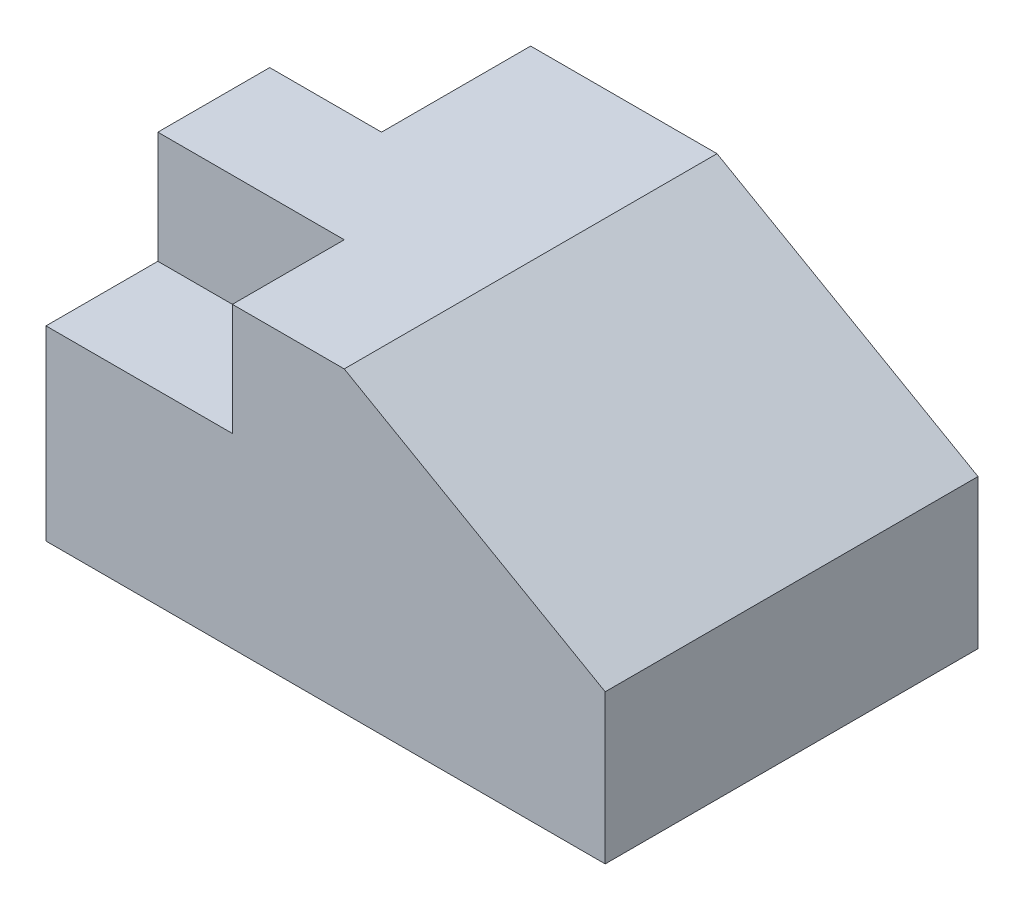
ISO-10303-21;
HEADER;
FILE_DESCRIPTION(('STEP AP214'),'2;1');
FILE_NAME('part.step','',(''),(''),'','','');
FILE_SCHEMA(('AUTOMOTIVE_DESIGN { 1 0 10303 214 1 1 1 1 }'));
ENDSEC;
DATA;
#1=APPLICATION_CONTEXT('core data for automotive mechanical design processes');
#2=APPLICATION_PROTOCOL_DEFINITION('international standard','automotive_design',2000,#1);
#3=PRODUCT_CONTEXT('',#1,'mechanical');
#4=PRODUCT('Part','Part','',(#3));
#5=PRODUCT_RELATED_PRODUCT_CATEGORY('part','',(#4));
#6=PRODUCT_DEFINITION_FORMATION('','',#4);
#7=PRODUCT_DEFINITION_CONTEXT('part definition',#1,'design');
#8=PRODUCT_DEFINITION('design','',#6,#7);
#9=PRODUCT_DEFINITION_SHAPE('','',#8);
#10=(LENGTH_UNIT() NAMED_UNIT(*) SI_UNIT(.MILLI.,.METRE.));
#11=(NAMED_UNIT(*) PLANE_ANGLE_UNIT() SI_UNIT($,.RADIAN.));
#12=(NAMED_UNIT(*) SI_UNIT($,.STERADIAN.) SOLID_ANGLE_UNIT());
#13=UNCERTAINTY_MEASURE_WITH_UNIT(LENGTH_MEASURE(1.E-05),#10,'distance_accuracy_value','');
#14=(GEOMETRIC_REPRESENTATION_CONTEXT(3) GLOBAL_UNCERTAINTY_ASSIGNED_CONTEXT((#13)) GLOBAL_UNIT_ASSIGNED_CONTEXT((#10,
#11,#12)) REPRESENTATION_CONTEXT('',''));
#15=CARTESIAN_POINT('',(0.,0.,0.));
#16=DIRECTION('',(0.,0.,1.));
#17=DIRECTION('',(1.,0.,0.));
#18=AXIS2_PLACEMENT_3D('',#15,#16,#17);
#19=CARTESIAN_POINT('',(0.,80.,-100.));
#20=DIRECTION('',(-1.,0.,0.));
#21=DIRECTION('',(0.,-1.,0.));
#22=AXIS2_PLACEMENT_3D('',#19,#20,#21);
#23=PLANE('',#22);
#24=DIRECTION('',(0.,1.,0.));
#25=VECTOR('',#24,1.);
#26=CARTESIAN_POINT('',(0.,50.,-30.));
#27=LINE('',#26,#25);
#28=CARTESIAN_POINT('',(0.,50.,-30.));
#29=VERTEX_POINT('',#28);
#30=CARTESIAN_POINT('',(0.,80.,-30.));
#31=VERTEX_POINT('',#30);
#32=EDGE_CURVE('E158',#29,#31,#27,.T.);
#33=ORIENTED_EDGE('',*,*,#32,.T.);
#34=DIRECTION('',(0.,0.,1.));
#35=VECTOR('',#34,1.);
#36=CARTESIAN_POINT('',(0.,80.,-100.));
#37=LINE('',#36,#35);
#38=CARTESIAN_POINT('',(0.,80.,-60.));
#39=VERTEX_POINT('',#38);
#40=EDGE_CURVE('E11',#39,#31,#37,.T.);
#41=ORIENTED_EDGE('',*,*,#40,.F.);
#42=DIRECTION('',(0.,1.,0.));
#43=VECTOR('',#42,1.);
#44=CARTESIAN_POINT('',(0.,50.,-60.));
#45=LINE('',#44,#43);
#46=CARTESIAN_POINT('',(0.,50.,-60.));
#47=VERTEX_POINT('',#46);
#48=EDGE_CURVE('E163',#47,#39,#45,.T.);
#49=ORIENTED_EDGE('',*,*,#48,.F.);
#50=DIRECTION('',(0.,0.,1.));
#51=VECTOR('',#50,1.);
#52=CARTESIAN_POINT('',(0.,50.,-100.));
#53=LINE('',#52,#51);
#54=CARTESIAN_POINT('',(0.,50.,-100.));
#55=VERTEX_POINT('',#54);
#56=EDGE_CURVE('E178',#55,#47,#53,.T.);
#57=ORIENTED_EDGE('',*,*,#56,.F.);
#58=DIRECTION('',(0.,-1.,0.));
#59=VECTOR('',#58,1.);
#60=CARTESIAN_POINT('',(0.,80.,-100.));
#61=LINE('',#60,#59);
#62=CARTESIAN_POINT('',(0.,0.,-100.));
#63=VERTEX_POINT('',#62);
#64=EDGE_CURVE('E193',#55,#63,#61,.T.);
#65=ORIENTED_EDGE('',*,*,#64,.T.);
#66=DIRECTION('',(0.,0.,1.));
#67=VECTOR('',#66,1.);
#68=CARTESIAN_POINT('',(0.,0.,-100.));
#69=LINE('',#68,#67);
#70=CARTESIAN_POINT('',(0.,0.,0.));
#71=VERTEX_POINT('',#70);
#72=EDGE_CURVE('E48',#63,#71,#69,.T.);
#73=ORIENTED_EDGE('',*,*,#72,.T.);
#74=DIRECTION('',(0.,-1.,0.));
#75=VECTOR('',#74,1.);
#76=CARTESIAN_POINT('',(0.,80.,0.));
#77=LINE('',#76,#75);
#78=CARTESIAN_POINT('',(0.,50.,0.));
#79=VERTEX_POINT('',#78);
#80=EDGE_CURVE('E212',#79,#71,#77,.T.);
#81=ORIENTED_EDGE('',*,*,#80,.F.);
#82=DIRECTION('',(0.,0.,1.));
#83=VECTOR('',#82,1.);
#84=CARTESIAN_POINT('',(0.,50.,0.));
#85=LINE('',#84,#83);
#86=EDGE_CURVE('E70',#29,#79,#85,.T.);
#87=ORIENTED_EDGE('',*,*,#86,.F.);
#88=EDGE_LOOP('',(#33,#41,#49,#57,#65,#73,#81,#87));
#89=FACE_BOUND('',#88,.T.);
#90=ADVANCED_FACE('F45',(#89),#23,.T.);
#91=CARTESIAN_POINT('',(80.,80.,-100.));
#92=DIRECTION('',(0.,1.,0.));
#93=DIRECTION('',(-1.,0.,0.));
#94=AXIS2_PLACEMENT_3D('',#91,#92,#93);
#95=PLANE('',#94);
#96=DIRECTION('',(-1.,0.,0.));
#97=VECTOR('',#96,1.);
#98=CARTESIAN_POINT('',(0.,80.,-30.));
#99=LINE('',#98,#97);
#100=CARTESIAN_POINT('',(50.,80.,-30.));
#101=VERTEX_POINT('',#100);
#102=EDGE_CURVE('E258',#101,#31,#99,.T.);
#103=ORIENTED_EDGE('',*,*,#102,.F.);
#104=DIRECTION('',(0.,0.,-1.));
#105=VECTOR('',#104,1.);
#106=CARTESIAN_POINT('',(50.,80.,0.));
#107=LINE('',#106,#105);
#108=CARTESIAN_POINT('',(50.,80.,0.));
#109=VERTEX_POINT('',#108);
#110=EDGE_CURVE('E182',#109,#101,#107,.T.);
#111=ORIENTED_EDGE('',*,*,#110,.F.);
#112=DIRECTION('',(-1.,0.,0.));
#113=VECTOR('',#112,1.);
#114=CARTESIAN_POINT('',(80.,80.,0.));
#115=LINE('',#114,#113);
#116=CARTESIAN_POINT('',(80.,80.,0.));
#117=VERTEX_POINT('',#116);
#118=EDGE_CURVE('E153',#117,#109,#115,.T.);
#119=ORIENTED_EDGE('',*,*,#118,.F.);
#120=DIRECTION('',(0.,0.,1.));
#121=VECTOR('',#120,1.);
#122=CARTESIAN_POINT('',(80.,80.,-100.));
#123=LINE('',#122,#121);
#124=CARTESIAN_POINT('',(80.,80.,-100.));
#125=VERTEX_POINT('',#124);
#126=EDGE_CURVE('E54',#125,#117,#123,.T.);
#127=ORIENTED_EDGE('',*,*,#126,.F.);
#128=DIRECTION('',(-1.,0.,0.));
#129=VECTOR('',#128,1.);
#130=CARTESIAN_POINT('',(80.,80.,-100.));
#131=LINE('',#130,#129);
#132=CARTESIAN_POINT('',(30.,80.,-100.));
#133=VERTEX_POINT('',#132);
#134=EDGE_CURVE('E208',#125,#133,#131,.T.);
#135=ORIENTED_EDGE('',*,*,#134,.T.);
#136=DIRECTION('',(0.,0.,-1.));
#137=VECTOR('',#136,1.);
#138=CARTESIAN_POINT('',(30.,80.,-100.));
#139=LINE('',#138,#137);
#140=CARTESIAN_POINT('',(30.,80.,-60.));
#141=VERTEX_POINT('',#140);
#142=EDGE_CURVE('E174',#141,#133,#139,.T.);
#143=ORIENTED_EDGE('',*,*,#142,.F.);
#144=DIRECTION('',(1.,0.,0.));
#145=VECTOR('',#144,1.);
#146=CARTESIAN_POINT('',(0.,80.,-60.));
#147=LINE('',#146,#145);
#148=EDGE_CURVE('E177',#39,#141,#147,.T.);
#149=ORIENTED_EDGE('',*,*,#148,.F.);
#150=ORIENTED_EDGE('',*,*,#40,.T.);
#151=EDGE_LOOP('',(#103,#111,#119,#127,#135,#143,#149,#150));
#152=FACE_BOUND('',#151,.T.);
#153=ADVANCED_FACE('F256',(#152),#95,.T.);
#154=CARTESIAN_POINT('',(150.,40.,-100.));
#155=DIRECTION('',(0.496138938356834,0.868243142124459,0.));
#156=DIRECTION('',(-0.868243142124459,0.496138938356834,0.));
#157=AXIS2_PLACEMENT_3D('',#154,#155,#156);
#158=PLANE('',#157);
#159=DIRECTION('',(-0.868243142124459,0.496138938356834,0.));
#160=VECTOR('',#159,1.);
#161=CARTESIAN_POINT('',(150.,40.,0.));
#162=LINE('',#161,#160);
#163=CARTESIAN_POINT('',(150.,40.,0.));
#164=VERTEX_POINT('',#163);
#165=EDGE_CURVE('E223',#164,#117,#162,.T.);
#166=ORIENTED_EDGE('',*,*,#165,.F.);
#167=DIRECTION('',(0.,0.,1.));
#168=VECTOR('',#167,1.);
#169=CARTESIAN_POINT('',(150.,40.,-100.));
#170=LINE('',#169,#168);
#171=CARTESIAN_POINT('',(150.,40.,-100.));
#172=VERTEX_POINT('',#171);
#173=EDGE_CURVE('E230',#172,#164,#170,.T.);
#174=ORIENTED_EDGE('',*,*,#173,.F.);
#175=DIRECTION('',(-0.868243142124459,0.496138938356834,0.));
#176=VECTOR('',#175,1.);
#177=CARTESIAN_POINT('',(150.,40.,-100.));
#178=LINE('',#177,#176);
#179=EDGE_CURVE('E204',#172,#125,#178,.T.);
#180=ORIENTED_EDGE('',*,*,#179,.T.);
#181=ORIENTED_EDGE('',*,*,#126,.T.);
#182=EDGE_LOOP('',(#166,#174,#180,#181));
#183=FACE_BOUND('',#182,.T.);
#184=ADVANCED_FACE('F252',(#183),#158,.T.);
#185=CARTESIAN_POINT('',(150.,0.,-100.));
#186=DIRECTION('',(1.,0.,0.));
#187=DIRECTION('',(0.,0.,-1.));
#188=AXIS2_PLACEMENT_3D('',#185,#186,#187);
#189=PLANE('',#188);
#190=DIRECTION('',(0.,1.,0.));
#191=VECTOR('',#190,1.);
#192=CARTESIAN_POINT('',(150.,0.,0.));
#193=LINE('',#192,#191);
#194=CARTESIAN_POINT('',(150.,0.,0.));
#195=VERTEX_POINT('',#194);
#196=EDGE_CURVE('E219',#195,#164,#193,.T.);
#197=ORIENTED_EDGE('',*,*,#196,.F.);
#198=DIRECTION('',(0.,0.,1.));
#199=VECTOR('',#198,1.);
#200=CARTESIAN_POINT('',(150.,0.,-100.));
#201=LINE('',#200,#199);
#202=CARTESIAN_POINT('',(150.,0.,-100.));
#203=VERTEX_POINT('',#202);
#204=EDGE_CURVE('E232',#203,#195,#201,.T.);
#205=ORIENTED_EDGE('',*,*,#204,.F.);
#206=DIRECTION('',(0.,1.,0.));
#207=VECTOR('',#206,1.);
#208=CARTESIAN_POINT('',(150.,0.,-100.));
#209=LINE('',#208,#207);
#210=EDGE_CURVE('E200',#203,#172,#209,.T.);
#211=ORIENTED_EDGE('',*,*,#210,.T.);
#212=ORIENTED_EDGE('',*,*,#173,.T.);
#213=EDGE_LOOP('',(#197,#205,#211,#212));
#214=FACE_BOUND('',#213,.T.);
#215=ADVANCED_FACE('F248',(#214),#189,.T.);
#216=CARTESIAN_POINT('',(0.,0.,-100.));
#217=DIRECTION('',(0.,-1.,0.));
#218=DIRECTION('',(0.,0.,-1.));
#219=AXIS2_PLACEMENT_3D('',#216,#217,#218);
#220=PLANE('',#219);
#221=DIRECTION('',(1.,0.,0.));
#222=VECTOR('',#221,1.);
#223=CARTESIAN_POINT('',(0.,0.,0.));
#224=LINE('',#223,#222);
#225=EDGE_CURVE('E215',#71,#195,#224,.T.);
#226=ORIENTED_EDGE('',*,*,#225,.F.);
#227=ORIENTED_EDGE('',*,*,#72,.F.);
#228=DIRECTION('',(1.,0.,0.));
#229=VECTOR('',#228,1.);
#230=CARTESIAN_POINT('',(0.,0.,-100.));
#231=LINE('',#230,#229);
#232=EDGE_CURVE('E196',#63,#203,#231,.T.);
#233=ORIENTED_EDGE('',*,*,#232,.T.);
#234=ORIENTED_EDGE('',*,*,#204,.T.);
#235=EDGE_LOOP('',(#226,#227,#233,#234));
#236=FACE_BOUND('',#235,.T.);
#237=ADVANCED_FACE('F245',(#236),#220,.T.);
#238=CARTESIAN_POINT('',(0.,0.,-100.));
#239=DIRECTION('',(0.,0.,1.));
#240=DIRECTION('',(1.,0.,0.));
#241=AXIS2_PLACEMENT_3D('',#238,#239,#240);
#242=PLANE('',#241);
#243=DIRECTION('',(-1.,0.,0.));
#244=VECTOR('',#243,1.);
#245=CARTESIAN_POINT('',(0.,50.,-100.));
#246=LINE('',#245,#244);
#247=CARTESIAN_POINT('',(30.,50.,-100.));
#248=VERTEX_POINT('',#247);
#249=EDGE_CURVE('E166',#248,#55,#246,.T.);
#250=ORIENTED_EDGE('',*,*,#249,.F.);
#251=DIRECTION('',(0.,1.,0.));
#252=VECTOR('',#251,1.);
#253=CARTESIAN_POINT('',(30.,50.,-100.));
#254=LINE('',#253,#252);
#255=EDGE_CURVE('E170',#248,#133,#254,.T.);
#256=ORIENTED_EDGE('',*,*,#255,.T.);
#257=ORIENTED_EDGE('',*,*,#134,.F.);
#258=ORIENTED_EDGE('',*,*,#179,.F.);
#259=ORIENTED_EDGE('',*,*,#210,.F.);
#260=ORIENTED_EDGE('',*,*,#232,.F.);
#261=ORIENTED_EDGE('',*,*,#64,.F.);
#262=EDGE_LOOP('',(#250,#256,#257,#258,#259,#260,#261));
#263=FACE_BOUND('',#262,.T.);
#264=ADVANCED_FACE('F272',(#263),#242,.F.);
#265=CARTESIAN_POINT('',(0.,0.,0.));
#266=DIRECTION('',(0.,0.,1.));
#267=DIRECTION('',(1.,0.,0.));
#268=AXIS2_PLACEMENT_3D('',#265,#266,#267);
#269=PLANE('',#268);
#270=DIRECTION('',(0.,1.,0.));
#271=VECTOR('',#270,1.);
#272=CARTESIAN_POINT('',(50.,50.,0.));
#273=LINE('',#272,#271);
#274=CARTESIAN_POINT('',(50.,50.,0.));
#275=VERTEX_POINT('',#274);
#276=EDGE_CURVE('E136',#275,#109,#273,.T.);
#277=ORIENTED_EDGE('',*,*,#276,.F.);
#278=DIRECTION('',(1.,0.,0.));
#279=VECTOR('',#278,1.);
#280=CARTESIAN_POINT('',(0.,50.,0.));
#281=LINE('',#280,#279);
#282=EDGE_CURVE('E142',#79,#275,#281,.T.);
#283=ORIENTED_EDGE('',*,*,#282,.F.);
#284=ORIENTED_EDGE('',*,*,#80,.T.);
#285=ORIENTED_EDGE('',*,*,#225,.T.);
#286=ORIENTED_EDGE('',*,*,#196,.T.);
#287=ORIENTED_EDGE('',*,*,#165,.T.);
#288=ORIENTED_EDGE('',*,*,#118,.T.);
#289=EDGE_LOOP('',(#277,#283,#284,#285,#286,#287,#288));
#290=FACE_BOUND('',#289,.T.);
#291=ADVANCED_FACE('F150',(#290),#269,.T.);
#292=CARTESIAN_POINT('',(0.,50.,-30.));
#293=DIRECTION('',(0.,0.,-1.));
#294=DIRECTION('',(-1.,0.,0.));
#295=AXIS2_PLACEMENT_3D('',#292,#293,#294);
#296=PLANE('',#295);
#297=ORIENTED_EDGE('',*,*,#102,.T.);
#298=ORIENTED_EDGE('',*,*,#32,.F.);
#299=DIRECTION('',(-1.,0.,0.));
#300=VECTOR('',#299,1.);
#301=CARTESIAN_POINT('',(0.,50.,-30.));
#302=LINE('',#301,#300);
#303=CARTESIAN_POINT('',(50.,50.,-30.));
#304=VERTEX_POINT('',#303);
#305=EDGE_CURVE('E141',#304,#29,#302,.T.);
#306=ORIENTED_EDGE('',*,*,#305,.F.);
#307=DIRECTION('',(0.,1.,0.));
#308=VECTOR('',#307,1.);
#309=CARTESIAN_POINT('',(50.,50.,-30.));
#310=LINE('',#309,#308);
#311=EDGE_CURVE('E138',#304,#101,#310,.T.);
#312=ORIENTED_EDGE('',*,*,#311,.T.);
#313=EDGE_LOOP('',(#297,#298,#306,#312));
#314=FACE_BOUND('',#313,.T.);
#315=ADVANCED_FACE('F303',(#314),#296,.F.);
#316=CARTESIAN_POINT('',(50.,50.,0.));
#317=DIRECTION('',(1.,0.,0.));
#318=DIRECTION('',(0.,1.,0.));
#319=AXIS2_PLACEMENT_3D('',#316,#317,#318);
#320=PLANE('',#319);
#321=ORIENTED_EDGE('',*,*,#110,.T.);
#322=ORIENTED_EDGE('',*,*,#311,.F.);
#323=DIRECTION('',(0.,0.,-1.));
#324=VECTOR('',#323,1.);
#325=CARTESIAN_POINT('',(50.,50.,0.));
#326=LINE('',#325,#324);
#327=EDGE_CURVE('E132',#275,#304,#326,.T.);
#328=ORIENTED_EDGE('',*,*,#327,.F.);
#329=ORIENTED_EDGE('',*,*,#276,.T.);
#330=EDGE_LOOP('',(#321,#322,#328,#329));
#331=FACE_BOUND('',#330,.T.);
#332=ADVANCED_FACE('F134',(#331),#320,.F.);
#333=CARTESIAN_POINT('',(0.,50.,0.));
#334=DIRECTION('',(0.,-1.,0.));
#335=DIRECTION('',(1.,0.,0.));
#336=AXIS2_PLACEMENT_3D('',#333,#334,#335);
#337=PLANE('',#336);
#338=ORIENTED_EDGE('',*,*,#86,.T.);
#339=ORIENTED_EDGE('',*,*,#282,.T.);
#340=ORIENTED_EDGE('',*,*,#327,.T.);
#341=ORIENTED_EDGE('',*,*,#305,.T.);
#342=EDGE_LOOP('',(#338,#339,#340,#341));
#343=FACE_BOUND('',#342,.T.);
#344=ADVANCED_FACE('F144',(#343),#337,.F.);
#345=CARTESIAN_POINT('',(30.,50.,-100.));
#346=DIRECTION('',(1.,0.,0.));
#347=DIRECTION('',(0.,0.,-1.));
#348=AXIS2_PLACEMENT_3D('',#345,#346,#347);
#349=PLANE('',#348);
#350=ORIENTED_EDGE('',*,*,#142,.T.);
#351=ORIENTED_EDGE('',*,*,#255,.F.);
#352=DIRECTION('',(0.,0.,-1.));
#353=VECTOR('',#352,1.);
#354=CARTESIAN_POINT('',(30.,50.,-100.));
#355=LINE('',#354,#353);
#356=CARTESIAN_POINT('',(30.,50.,-60.));
#357=VERTEX_POINT('',#356);
#358=EDGE_CURVE('E62',#357,#248,#355,.T.);
#359=ORIENTED_EDGE('',*,*,#358,.F.);
#360=DIRECTION('',(0.,1.,0.));
#361=VECTOR('',#360,1.);
#362=CARTESIAN_POINT('',(30.,50.,-60.));
#363=LINE('',#362,#361);
#364=EDGE_CURVE('E167',#357,#141,#363,.T.);
#365=ORIENTED_EDGE('',*,*,#364,.T.);
#366=EDGE_LOOP('',(#350,#351,#359,#365));
#367=FACE_BOUND('',#366,.T.);
#368=ADVANCED_FACE('F274',(#367),#349,.F.);
#369=CARTESIAN_POINT('',(0.,50.,-60.));
#370=DIRECTION('',(0.,0.,1.));
#371=DIRECTION('',(1.,0.,0.));
#372=AXIS2_PLACEMENT_3D('',#369,#370,#371);
#373=PLANE('',#372);
#374=ORIENTED_EDGE('',*,*,#148,.T.);
#375=ORIENTED_EDGE('',*,*,#364,.F.);
#376=DIRECTION('',(1.,0.,0.));
#377=VECTOR('',#376,1.);
#378=CARTESIAN_POINT('',(0.,50.,-60.));
#379=LINE('',#378,#377);
#380=EDGE_CURVE('E187',#47,#357,#379,.T.);
#381=ORIENTED_EDGE('',*,*,#380,.F.);
#382=ORIENTED_EDGE('',*,*,#48,.T.);
#383=EDGE_LOOP('',(#374,#375,#381,#382));
#384=FACE_BOUND('',#383,.T.);
#385=ADVANCED_FACE('F269',(#384),#373,.F.);
#386=CARTESIAN_POINT('',(0.,50.,0.));
#387=DIRECTION('',(0.,1.,0.));
#388=DIRECTION('',(0.,0.,1.));
#389=AXIS2_PLACEMENT_3D('',#386,#387,#388);
#390=PLANE('',#389);
#391=ORIENTED_EDGE('',*,*,#56,.T.);
#392=ORIENTED_EDGE('',*,*,#380,.T.);
#393=ORIENTED_EDGE('',*,*,#358,.T.);
#394=ORIENTED_EDGE('',*,*,#249,.T.);
#395=EDGE_LOOP('',(#391,#392,#393,#394));
#396=FACE_BOUND('',#395,.T.);
#397=ADVANCED_FACE('F275',(#396),#390,.T.);
#398=CLOSED_SHELL('',(#90,#153,#184,#215,#237,#264,#291,#315,#332,#344,#368,#385,#397));
#399=MANIFOLD_SOLID_BREP('B2',#398);
#400=ADVANCED_BREP_SHAPE_REPRESENTATION('',(#18,#399),#14);
#401=SHAPE_DEFINITION_REPRESENTATION(#9,#400);
ENDSEC;
END-ISO-10303-21;
